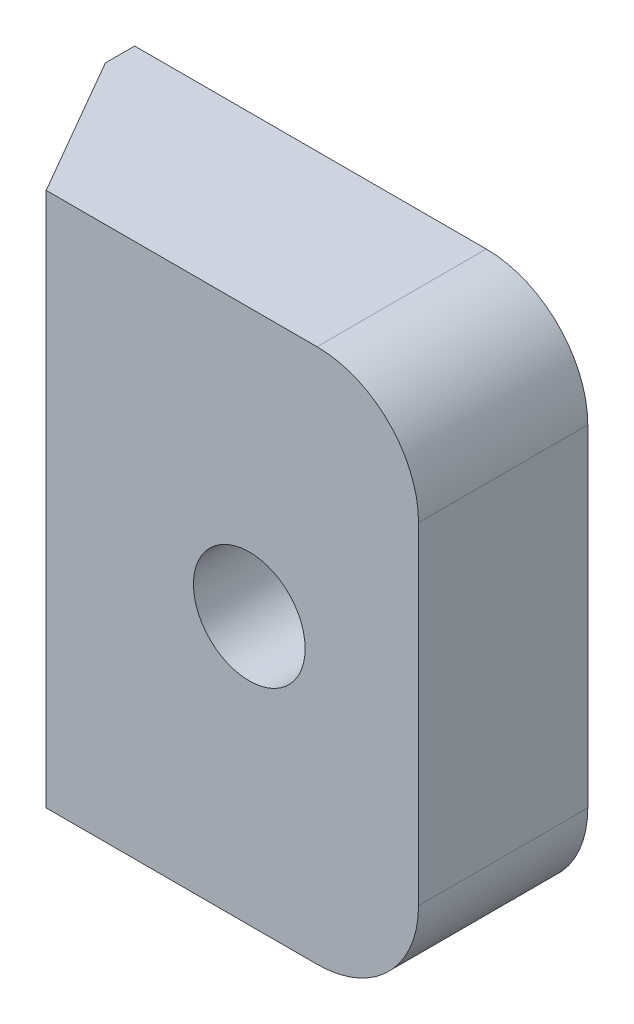
ISO-10303-21;
HEADER;
FILE_DESCRIPTION(('STEP AP214'),'2;1');
FILE_NAME('part.step','',(''),(''),'','','');
FILE_SCHEMA(('AUTOMOTIVE_DESIGN { 1 0 10303 214 1 1 1 1 }'));
ENDSEC;
DATA;
#1=APPLICATION_CONTEXT('core data for automotive mechanical design processes');
#2=APPLICATION_PROTOCOL_DEFINITION('international standard','automotive_design',2000,#1);
#3=PRODUCT_CONTEXT('',#1,'mechanical');
#4=PRODUCT('Part','Part','',(#3));
#5=PRODUCT_RELATED_PRODUCT_CATEGORY('part','',(#4));
#6=PRODUCT_DEFINITION_FORMATION('','',#4);
#7=PRODUCT_DEFINITION_CONTEXT('part definition',#1,'design');
#8=PRODUCT_DEFINITION('design','',#6,#7);
#9=PRODUCT_DEFINITION_SHAPE('','',#8);
#10=(LENGTH_UNIT() NAMED_UNIT(*) SI_UNIT(.MILLI.,.METRE.));
#11=(NAMED_UNIT(*) PLANE_ANGLE_UNIT() SI_UNIT($,.RADIAN.));
#12=(NAMED_UNIT(*) SI_UNIT($,.STERADIAN.) SOLID_ANGLE_UNIT());
#13=UNCERTAINTY_MEASURE_WITH_UNIT(LENGTH_MEASURE(1.E-05),#10,'distance_accuracy_value','');
#14=(GEOMETRIC_REPRESENTATION_CONTEXT(3) GLOBAL_UNCERTAINTY_ASSIGNED_CONTEXT((#13)) GLOBAL_UNIT_ASSIGNED_CONTEXT((#10,
#11,#12)) REPRESENTATION_CONTEXT('',''));
#15=CARTESIAN_POINT('',(0.,0.,0.));
#16=DIRECTION('',(0.,0.,1.));
#17=DIRECTION('',(1.,0.,0.));
#18=AXIS2_PLACEMENT_3D('',#15,#16,#17);
#19=CARTESIAN_POINT('',(-11.,15.8,0.));
#20=DIRECTION('',(0.,0.,-1.));
#21=DIRECTION('',(-1.,0.,0.));
#22=AXIS2_PLACEMENT_3D('',#19,#20,#21);
#23=PLANE('',#22);
#24=CARTESIAN_POINT('',(-5.,7.9,0.));
#25=DIRECTION('',(0.,0.,1.));
#26=DIRECTION('',(1.,0.,0.));
#27=AXIS2_PLACEMENT_3D('',#24,#25,#26);
#28=CIRCLE('',#27,1.64999999999999);
#29=CARTESIAN_POINT('',(-3.35000000000001,7.9,0.));
#30=VERTEX_POINT('',#29);
#31=EDGE_CURVE('E252',#30,#30,#28,.T.);
#32=ORIENTED_EDGE('',*,*,#31,.F.);
#33=EDGE_LOOP('',(#32));
#34=FACE_BOUND('',#33,.T.);
#35=DIRECTION('',(1.,0.,0.));
#36=VECTOR('',#35,1.);
#37=CARTESIAN_POINT('',(-11.,0.,0.));
#38=LINE('',#37,#36);
#39=CARTESIAN_POINT('',(-11.,0.,0.));
#40=VERTEX_POINT('',#39);
#41=CARTESIAN_POINT('',(-3.,0.,0.));
#42=VERTEX_POINT('',#41);
#43=EDGE_CURVE('E127',#40,#42,#38,.T.);
#44=ORIENTED_EDGE('',*,*,#43,.T.);
#45=CARTESIAN_POINT('',(-3.,3.,0.));
#46=DIRECTION('',(0.,0.,-1.));
#47=DIRECTION('',(-1.,0.,0.));
#48=AXIS2_PLACEMENT_3D('',#45,#46,#47);
#49=CIRCLE('',#48,3.);
#50=CARTESIAN_POINT('',(0.,3.,0.));
#51=VERTEX_POINT('',#50);
#52=EDGE_CURVE('E147',#42,#51,#49,.F.);
#53=ORIENTED_EDGE('',*,*,#52,.T.);
#54=DIRECTION('',(0.,-1.,0.));
#55=VECTOR('',#54,1.);
#56=CARTESIAN_POINT('',(0.,15.8,0.));
#57=LINE('',#56,#55);
#58=CARTESIAN_POINT('',(0.,12.8,0.));
#59=VERTEX_POINT('',#58);
#60=EDGE_CURVE('E132',#59,#51,#57,.T.);
#61=ORIENTED_EDGE('',*,*,#60,.F.);
#62=CARTESIAN_POINT('',(-3.,12.8,0.));
#63=DIRECTION('',(0.,0.,-1.));
#64=DIRECTION('',(-1.,0.,0.));
#65=AXIS2_PLACEMENT_3D('',#62,#63,#64);
#66=CIRCLE('',#65,3.);
#67=CARTESIAN_POINT('',(-3.,15.8,0.));
#68=VERTEX_POINT('',#67);
#69=EDGE_CURVE('E118',#59,#68,#66,.F.);
#70=ORIENTED_EDGE('',*,*,#69,.T.);
#71=DIRECTION('',(1.,0.,0.));
#72=VECTOR('',#71,1.);
#73=CARTESIAN_POINT('',(-11.,15.8,0.));
#74=LINE('',#73,#72);
#75=CARTESIAN_POINT('',(-11.,15.8,0.));
#76=VERTEX_POINT('',#75);
#77=EDGE_CURVE('E99',#76,#68,#74,.T.);
#78=ORIENTED_EDGE('',*,*,#77,.F.);
#79=DIRECTION('',(0.,-1.,0.));
#80=VECTOR('',#79,1.);
#81=CARTESIAN_POINT('',(-11.,15.8,0.));
#82=LINE('',#81,#80);
#83=EDGE_CURVE('E105',#76,#40,#82,.T.);
#84=ORIENTED_EDGE('',*,*,#83,.T.);
#85=EDGE_LOOP('',(#44,#53,#61,#70,#78,#84));
#86=FACE_BOUND('',#85,.T.);
#87=ADVANCED_FACE('F35',(#34,#86),#23,.F.);
#88=CARTESIAN_POINT('',(0.,15.8,0.));
#89=DIRECTION('',(-1.,0.,0.));
#90=DIRECTION('',(0.,0.,1.));
#91=AXIS2_PLACEMENT_3D('',#88,#89,#90);
#92=PLANE('',#91);
#93=ORIENTED_EDGE('',*,*,#60,.T.);
#94=DIRECTION('',(0.,0.,-1.));
#95=VECTOR('',#94,1.);
#96=CARTESIAN_POINT('',(0.,3.,0.));
#97=LINE('',#96,#95);
#98=CARTESIAN_POINT('',(0.,3.,-5.));
#99=VERTEX_POINT('',#98);
#100=EDGE_CURVE('E137',#51,#99,#97,.T.);
#101=ORIENTED_EDGE('',*,*,#100,.T.);
#102=DIRECTION('',(0.,-1.,0.));
#103=VECTOR('',#102,1.);
#104=CARTESIAN_POINT('',(0.,15.8,-5.));
#105=LINE('',#104,#103);
#106=CARTESIAN_POINT('',(0.,12.8,-5.));
#107=VERTEX_POINT('',#106);
#108=EDGE_CURVE('E114',#107,#99,#105,.T.);
#109=ORIENTED_EDGE('',*,*,#108,.F.);
#110=DIRECTION('',(0.,0.,-1.));
#111=VECTOR('',#110,1.);
#112=CARTESIAN_POINT('',(0.,12.8,0.));
#113=LINE('',#112,#111);
#114=EDGE_CURVE('E135',#107,#59,#113,.F.);
#115=ORIENTED_EDGE('',*,*,#114,.T.);
#116=EDGE_LOOP('',(#93,#101,#109,#115));
#117=FACE_BOUND('',#116,.T.);
#118=ADVANCED_FACE('F162',(#117),#92,.F.);
#119=CARTESIAN_POINT('',(0.,15.8,-5.));
#120=DIRECTION('',(0.,0.,1.));
#121=DIRECTION('',(1.,0.,0.));
#122=AXIS2_PLACEMENT_3D('',#119,#120,#121);
#123=PLANE('',#122);
#124=CARTESIAN_POINT('',(-5.,7.9,-5.));
#125=DIRECTION('',(0.,0.,1.));
#126=DIRECTION('',(1.,0.,0.));
#127=AXIS2_PLACEMENT_3D('',#124,#125,#126);
#128=CIRCLE('',#127,1.65);
#129=CARTESIAN_POINT('',(-3.35,7.9,-5.));
#130=VERTEX_POINT('',#129);
#131=EDGE_CURVE('E124',#130,#130,#128,.T.);
#132=ORIENTED_EDGE('',*,*,#131,.T.);
#133=EDGE_LOOP('',(#132));
#134=FACE_BOUND('',#133,.T.);
#135=DIRECTION('',(-1.,0.,0.));
#136=VECTOR('',#135,1.);
#137=CARTESIAN_POINT('',(0.,0.,-5.));
#138=LINE('',#137,#136);
#139=CARTESIAN_POINT('',(-3.,0.,-5.));
#140=VERTEX_POINT('',#139);
#141=CARTESIAN_POINT('',(-13.3867513459481,0.,-5.));
#142=VERTEX_POINT('',#141);
#143=EDGE_CURVE('E121',#140,#142,#138,.T.);
#144=ORIENTED_EDGE('',*,*,#143,.T.);
#145=DIRECTION('',(0.,1.,0.));
#146=VECTOR('',#145,1.);
#147=CARTESIAN_POINT('',(-13.3867513459481,15.8,-5.));
#148=LINE('',#147,#146);
#149=CARTESIAN_POINT('',(-13.3867513459481,15.8,-5.));
#150=VERTEX_POINT('',#149);
#151=EDGE_CURVE('E43',#142,#150,#148,.T.);
#152=ORIENTED_EDGE('',*,*,#151,.T.);
#153=DIRECTION('',(-1.,0.,0.));
#154=VECTOR('',#153,1.);
#155=CARTESIAN_POINT('',(0.,15.8,-5.));
#156=LINE('',#155,#154);
#157=CARTESIAN_POINT('',(-3.,15.8,-5.));
#158=VERTEX_POINT('',#157);
#159=EDGE_CURVE('E106',#158,#150,#156,.T.);
#160=ORIENTED_EDGE('',*,*,#159,.F.);
#161=CARTESIAN_POINT('',(-3.,12.8,-5.));
#162=DIRECTION('',(0.,0.,1.));
#163=DIRECTION('',(1.,0.,0.));
#164=AXIS2_PLACEMENT_3D('',#161,#162,#163);
#165=CIRCLE('',#164,3.);
#166=EDGE_CURVE('E140',#158,#107,#165,.F.);
#167=ORIENTED_EDGE('',*,*,#166,.T.);
#168=ORIENTED_EDGE('',*,*,#108,.T.);
#169=CARTESIAN_POINT('',(-3.,3.,-5.));
#170=DIRECTION('',(0.,0.,1.));
#171=DIRECTION('',(1.,0.,0.));
#172=AXIS2_PLACEMENT_3D('',#169,#170,#171);
#173=CIRCLE('',#172,3.);
#174=EDGE_CURVE('E142',#99,#140,#173,.F.);
#175=ORIENTED_EDGE('',*,*,#174,.T.);
#176=EDGE_LOOP('',(#144,#152,#160,#167,#168,#175));
#177=FACE_BOUND('',#176,.T.);
#178=ADVANCED_FACE('F164',(#134,#177),#123,.F.);
#179=CARTESIAN_POINT('',(-13.8867513459481,15.8,-5.));
#180=DIRECTION('',(0.86602540378444,0.,-0.499999999999998));
#181=DIRECTION('',(-0.499999999999998,0.,-0.86602540378444));
#182=AXIS2_PLACEMENT_3D('',#179,#180,#181);
#183=PLANE('',#182);
#184=DIRECTION('',(0.499999999999998,0.,0.86602540378444));
#185=VECTOR('',#184,1.);
#186=CARTESIAN_POINT('',(-13.8867513459481,15.8,-5.));
#187=LINE('',#186,#185);
#188=CARTESIAN_POINT('',(-13.3867513459481,15.8,-4.13397459621555));
#189=VERTEX_POINT('',#188);
#190=EDGE_CURVE('E94',#189,#76,#187,.T.);
#191=ORIENTED_EDGE('',*,*,#190,.F.);
#192=DIRECTION('',(0.,-1.,0.));
#193=VECTOR('',#192,1.);
#194=CARTESIAN_POINT('',(-13.3867513459481,15.8,-4.13397459621555));
#195=LINE('',#194,#193);
#196=CARTESIAN_POINT('',(-13.3867513459481,0.,-4.13397459621555));
#197=VERTEX_POINT('',#196);
#198=EDGE_CURVE('E151',#189,#197,#195,.T.);
#199=ORIENTED_EDGE('',*,*,#198,.T.);
#200=DIRECTION('',(0.499999999999998,0.,0.86602540378444));
#201=VECTOR('',#200,1.);
#202=CARTESIAN_POINT('',(-13.8867513459481,0.,-5.));
#203=LINE('',#202,#201);
#204=EDGE_CURVE('E110',#197,#40,#203,.T.);
#205=ORIENTED_EDGE('',*,*,#204,.T.);
#206=ORIENTED_EDGE('',*,*,#83,.F.);
#207=EDGE_LOOP('',(#191,#199,#205,#206));
#208=FACE_BOUND('',#207,.T.);
#209=ADVANCED_FACE('F109',(#208),#183,.F.);
#210=CARTESIAN_POINT('',(0.,15.8,0.));
#211=DIRECTION('',(0.,1.,0.));
#212=DIRECTION('',(0.,0.,1.));
#213=AXIS2_PLACEMENT_3D('',#210,#211,#212);
#214=PLANE('',#213);
#215=ORIENTED_EDGE('',*,*,#159,.T.);
#216=DIRECTION('',(0.,0.,-1.));
#217=VECTOR('',#216,1.);
#218=CARTESIAN_POINT('',(-13.3867513459481,15.8,0.));
#219=LINE('',#218,#217);
#220=EDGE_CURVE('E11',#150,#189,#219,.F.);
#221=ORIENTED_EDGE('',*,*,#220,.T.);
#222=ORIENTED_EDGE('',*,*,#190,.T.);
#223=ORIENTED_EDGE('',*,*,#77,.T.);
#224=DIRECTION('',(0.,0.,-1.));
#225=VECTOR('',#224,1.);
#226=CARTESIAN_POINT('',(-3.,15.8,-5.));
#227=LINE('',#226,#225);
#228=EDGE_CURVE('E149',#68,#158,#227,.T.);
#229=ORIENTED_EDGE('',*,*,#228,.T.);
#230=EDGE_LOOP('',(#215,#221,#222,#223,#229));
#231=FACE_BOUND('',#230,.T.);
#232=ADVANCED_FACE('F96',(#231),#214,.T.);
#233=CARTESIAN_POINT('',(0.,0.,0.));
#234=DIRECTION('',(0.,1.,0.));
#235=DIRECTION('',(0.,0.,1.));
#236=AXIS2_PLACEMENT_3D('',#233,#234,#235);
#237=PLANE('',#236);
#238=ORIENTED_EDGE('',*,*,#204,.F.);
#239=DIRECTION('',(0.,0.,1.));
#240=VECTOR('',#239,1.);
#241=CARTESIAN_POINT('',(-13.3867513459481,0.,-4.13397459621555));
#242=LINE('',#241,#240);
#243=EDGE_CURVE('E57',#197,#142,#242,.F.);
#244=ORIENTED_EDGE('',*,*,#243,.T.);
#245=ORIENTED_EDGE('',*,*,#143,.F.);
#246=DIRECTION('',(0.,0.,-1.));
#247=VECTOR('',#246,1.);
#248=CARTESIAN_POINT('',(-3.,0.,0.));
#249=LINE('',#248,#247);
#250=EDGE_CURVE('E144',#140,#42,#249,.F.);
#251=ORIENTED_EDGE('',*,*,#250,.T.);
#252=ORIENTED_EDGE('',*,*,#43,.F.);
#253=EDGE_LOOP('',(#238,#244,#245,#251,#252));
#254=FACE_BOUND('',#253,.T.);
#255=ADVANCED_FACE('F154',(#254),#237,.F.);
#256=CARTESIAN_POINT('',(-3.,3.,0.));
#257=DIRECTION('',(0.,0.,-1.));
#258=DIRECTION('',(-1.,0.,0.));
#259=AXIS2_PLACEMENT_3D('',#256,#257,#258);
#260=CYLINDRICAL_SURFACE('',#259,3.);
#261=ORIENTED_EDGE('',*,*,#52,.F.);
#262=ORIENTED_EDGE('',*,*,#250,.F.);
#263=ORIENTED_EDGE('',*,*,#174,.F.);
#264=ORIENTED_EDGE('',*,*,#100,.F.);
#265=EDGE_LOOP('',(#261,#262,#263,#264));
#266=FACE_BOUND('',#265,.T.);
#267=ADVANCED_FACE('F159',(#266),#260,.T.);
#268=CARTESIAN_POINT('',(-3.,12.8,0.));
#269=DIRECTION('',(0.,0.,1.));
#270=DIRECTION('',(1.,0.,0.));
#271=AXIS2_PLACEMENT_3D('',#268,#269,#270);
#272=CYLINDRICAL_SURFACE('',#271,3.);
#273=ORIENTED_EDGE('',*,*,#69,.F.);
#274=ORIENTED_EDGE('',*,*,#114,.F.);
#275=ORIENTED_EDGE('',*,*,#166,.F.);
#276=ORIENTED_EDGE('',*,*,#228,.F.);
#277=EDGE_LOOP('',(#273,#274,#275,#276));
#278=FACE_BOUND('',#277,.T.);
#279=ADVANCED_FACE('F166',(#278),#272,.T.);
#280=CARTESIAN_POINT('',(-5.,7.9,0.));
#281=DIRECTION('',(0.,0.,1.));
#282=DIRECTION('',(1.,0.,0.));
#283=AXIS2_PLACEMENT_3D('',#280,#281,#282);
#284=CYLINDRICAL_SURFACE('',#283,1.64999999999999);
#285=ORIENTED_EDGE('',*,*,#131,.F.);
#286=EDGE_LOOP('',(#285));
#287=FACE_BOUND('',#286,.T.);
#288=ORIENTED_EDGE('',*,*,#31,.T.);
#289=EDGE_LOOP('',(#288));
#290=FACE_BOUND('',#289,.T.);
#291=ADVANCED_FACE('F168',(#287,#290),#284,.F.);
#292=CARTESIAN_POINT('',(-13.3867513459481,15.8,-4.13397459621555));
#293=DIRECTION('',(1.,0.,0.));
#294=DIRECTION('',(0.,-1.,0.));
#295=AXIS2_PLACEMENT_3D('',#292,#293,#294);
#296=PLANE('',#295);
#297=ORIENTED_EDGE('',*,*,#220,.F.);
#298=ORIENTED_EDGE('',*,*,#151,.F.);
#299=ORIENTED_EDGE('',*,*,#243,.F.);
#300=ORIENTED_EDGE('',*,*,#198,.F.);
#301=EDGE_LOOP('',(#297,#298,#299,#300));
#302=FACE_BOUND('',#301,.T.);
#303=ADVANCED_FACE('F37',(#302),#296,.F.);
#304=CLOSED_SHELL('',(#87,#118,#178,#209,#232,#255,#267,#279,#291,#303));
#305=MANIFOLD_SOLID_BREP('B2',#304);
#306=ADVANCED_BREP_SHAPE_REPRESENTATION('',(#18,#305),#14);
#307=SHAPE_DEFINITION_REPRESENTATION(#9,#306);
ENDSEC;
END-ISO-10303-21;
